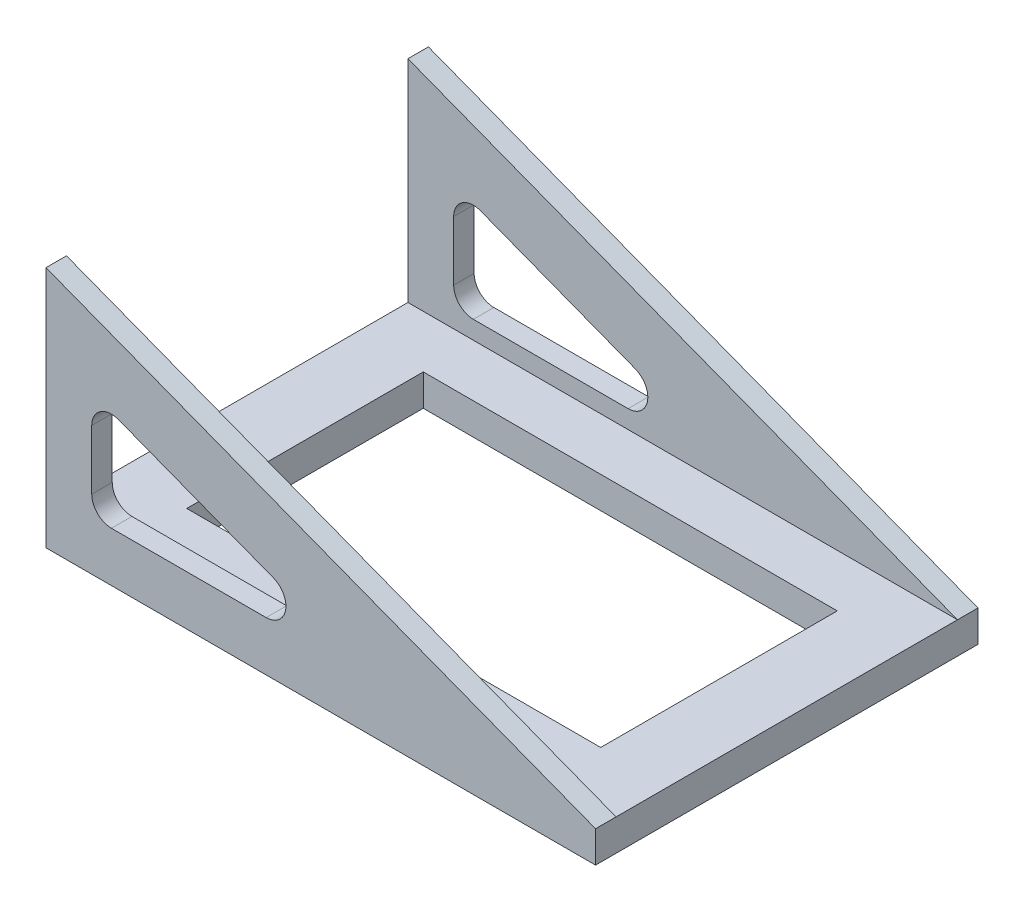
ISO-10303-21;
HEADER;
FILE_DESCRIPTION(('STEP AP214'),'2;1');
FILE_NAME('part.step','',(''),(''),'','','');
FILE_SCHEMA(('AUTOMOTIVE_DESIGN { 1 0 10303 214 1 1 1 1 }'));
ENDSEC;
DATA;
#1=APPLICATION_CONTEXT('core data for automotive mechanical design processes');
#2=APPLICATION_PROTOCOL_DEFINITION('international standard','automotive_design',2000,#1);
#3=PRODUCT_CONTEXT('',#1,'mechanical');
#4=PRODUCT('Part','Part','',(#3));
#5=PRODUCT_RELATED_PRODUCT_CATEGORY('part','',(#4));
#6=PRODUCT_DEFINITION_FORMATION('','',#4);
#7=PRODUCT_DEFINITION_CONTEXT('part definition',#1,'design');
#8=PRODUCT_DEFINITION('design','',#6,#7);
#9=PRODUCT_DEFINITION_SHAPE('','',#8);
#10=(LENGTH_UNIT() NAMED_UNIT(*) SI_UNIT(.MILLI.,.METRE.));
#11=(NAMED_UNIT(*) PLANE_ANGLE_UNIT() SI_UNIT($,.RADIAN.));
#12=(NAMED_UNIT(*) SI_UNIT($,.STERADIAN.) SOLID_ANGLE_UNIT());
#13=UNCERTAINTY_MEASURE_WITH_UNIT(LENGTH_MEASURE(1.E-05),#10,'distance_accuracy_value','');
#14=(GEOMETRIC_REPRESENTATION_CONTEXT(3) GLOBAL_UNCERTAINTY_ASSIGNED_CONTEXT((#13)) GLOBAL_UNIT_ASSIGNED_CONTEXT((#10,
#11,#12)) REPRESENTATION_CONTEXT('',''));
#15=CARTESIAN_POINT('',(0.,0.,0.));
#16=DIRECTION('',(0.,0.,1.));
#17=DIRECTION('',(1.,0.,0.));
#18=AXIS2_PLACEMENT_3D('',#15,#16,#17);
#19=CARTESIAN_POINT('',(-17.5919573041021,22.352,-54.991));
#20=DIRECTION('',(0.,0.,-1.));
#21=DIRECTION('',(-1.,0.,0.));
#22=AXIS2_PLACEMENT_3D('',#19,#20,#21);
#23=CYLINDRICAL_SURFACE('',#22,6.35000000000001);
#24=DIRECTION('',(0.,0.,1.));
#25=VECTOR('',#24,1.);
#26=CARTESIAN_POINT('',(-17.5919573041028,16.002,-54.991));
#27=LINE('',#26,#25);
#28=CARTESIAN_POINT('',(-17.5919573041025,16.002,-54.991));
#29=VERTEX_POINT('',#28);
#30=CARTESIAN_POINT('',(-17.5919573041025,16.002,-61.595));
#31=VERTEX_POINT('',#30);
#32=EDGE_CURVE('E220',#29,#31,#27,.F.);
#33=ORIENTED_EDGE('',*,*,#32,.F.);
#34=CARTESIAN_POINT('',(-17.5919573041021,22.352,-54.991));
#35=DIRECTION('',(0.,0.,-1.));
#36=DIRECTION('',(-1.,0.,0.));
#37=AXIS2_PLACEMENT_3D('',#34,#35,#36);
#38=CIRCLE('',#37,6.35000000000001);
#39=CARTESIAN_POINT('',(-15.3148623858333,28.2796756602563,-54.991));
#40=VERTEX_POINT('',#39);
#41=EDGE_CURVE('E278',#29,#40,#38,.F.);
#42=ORIENTED_EDGE('',*,*,#41,.T.);
#43=DIRECTION('',(0.,0.,1.));
#44=VECTOR('',#43,1.);
#45=CARTESIAN_POINT('',(-15.3148623858336,28.2796756602564,-54.991));
#46=LINE('',#45,#44);
#47=CARTESIAN_POINT('',(-15.3148623858333,28.2796756602563,-61.595));
#48=VERTEX_POINT('',#47);
#49=EDGE_CURVE('E231',#48,#40,#46,.T.);
#50=ORIENTED_EDGE('',*,*,#49,.F.);
#51=CARTESIAN_POINT('',(-17.5919573041021,22.352,-61.595));
#52=DIRECTION('',(0.,0.,-1.));
#53=DIRECTION('',(-1.,0.,0.));
#54=AXIS2_PLACEMENT_3D('',#51,#52,#53);
#55=CIRCLE('',#54,6.35000000000001);
#56=EDGE_CURVE('E267',#31,#48,#55,.F.);
#57=ORIENTED_EDGE('',*,*,#56,.F.);
#58=EDGE_LOOP('',(#33,#42,#50,#57));
#59=FACE_BOUND('',#58,.T.);
#60=ADVANCED_FACE('F16',(#59),#23,.F.);
#61=CARTESIAN_POINT('',(7.49719488457461,19.5165073185752,-54.991));
#62=DIRECTION('',(-0.358597624924271,-0.933492229961595,0.));
#63=DIRECTION('',(0.933492229961595,-0.358597624924271,0.));
#64=AXIS2_PLACEMENT_3D('',#61,#62,#63);
#65=PLANE('',#64);
#66=DIRECTION('',(-0.933492229961595,0.358597624924271,0.));
#67=VECTOR('',#66,1.);
#68=CARTESIAN_POINT('',(-15.3148623858336,28.2796756602564,-54.991));
#69=LINE('',#68,#67);
#70=CARTESIAN_POINT('',(-65.1599050817309,47.427466451973,-54.991));
#71=VERTEX_POINT('',#70);
#72=EDGE_CURVE('E211',#40,#71,#69,.T.);
#73=ORIENTED_EDGE('',*,*,#72,.T.);
#74=DIRECTION('',(0.,0.,-1.));
#75=VECTOR('',#74,1.);
#76=CARTESIAN_POINT('',(-65.1599050817308,47.427466451973,-54.991));
#77=LINE('',#76,#75);
#78=CARTESIAN_POINT('',(-65.1599050817309,47.427466451973,-61.595));
#79=VERTEX_POINT('',#78);
#80=EDGE_CURVE('E182',#71,#79,#77,.T.);
#81=ORIENTED_EDGE('',*,*,#80,.T.);
#82=DIRECTION('',(-0.933492229961595,0.358597624924271,0.));
#83=VECTOR('',#82,1.);
#84=CARTESIAN_POINT('',(-15.3148623858336,28.2796756602564,-61.595));
#85=LINE('',#84,#83);
#86=EDGE_CURVE('E266',#48,#79,#85,.T.);
#87=ORIENTED_EDGE('',*,*,#86,.F.);
#88=ORIENTED_EDGE('',*,*,#49,.T.);
#89=EDGE_LOOP('',(#73,#81,#87,#88));
#90=FACE_BOUND('',#89,.T.);
#91=ADVANCED_FACE('F504',(#90),#65,.T.);
#92=CARTESIAN_POINT('',(-67.437,41.4997907917169,-54.991));
#93=DIRECTION('',(0.,0.,-1.));
#94=DIRECTION('',(-1.,0.,0.));
#95=AXIS2_PLACEMENT_3D('',#92,#93,#94);
#96=CYLINDRICAL_SURFACE('',#95,6.35000000000001);
#97=ORIENTED_EDGE('',*,*,#80,.F.);
#98=CARTESIAN_POINT('',(-67.437,41.4997907917169,-54.991));
#99=DIRECTION('',(0.,0.,-1.));
#100=DIRECTION('',(-1.,0.,0.));
#101=AXIS2_PLACEMENT_3D('',#98,#99,#100);
#102=CIRCLE('',#101,6.35000000000001);
#103=CARTESIAN_POINT('',(-73.787,41.4997907917168,-54.991));
#104=VERTEX_POINT('',#103);
#105=EDGE_CURVE('E19',#71,#104,#102,.F.);
#106=ORIENTED_EDGE('',*,*,#105,.T.);
#107=DIRECTION('',(0.,0.,1.));
#108=VECTOR('',#107,1.);
#109=CARTESIAN_POINT('',(-73.787,41.4997907917168,-54.991));
#110=LINE('',#109,#108);
#111=CARTESIAN_POINT('',(-73.787,41.4997907917168,-61.595));
#112=VERTEX_POINT('',#111);
#113=EDGE_CURVE('E190',#112,#104,#110,.T.);
#114=ORIENTED_EDGE('',*,*,#113,.F.);
#115=CARTESIAN_POINT('',(-67.437,41.4997907917169,-61.595));
#116=DIRECTION('',(0.,0.,-1.));
#117=DIRECTION('',(-1.,0.,0.));
#118=AXIS2_PLACEMENT_3D('',#115,#116,#117);
#119=CIRCLE('',#118,6.35000000000001);
#120=EDGE_CURVE('E263',#79,#112,#119,.F.);
#121=ORIENTED_EDGE('',*,*,#120,.F.);
#122=EDGE_LOOP('',(#97,#106,#114,#121));
#123=FACE_BOUND('',#122,.T.);
#124=ADVANCED_FACE('F209',(#123),#96,.F.);
#125=CARTESIAN_POINT('',(-73.787,0.,-54.991));
#126=DIRECTION('',(1.,0.,0.));
#127=DIRECTION('',(0.,1.,0.));
#128=AXIS2_PLACEMENT_3D('',#125,#126,#127);
#129=PLANE('',#128);
#130=DIRECTION('',(0.,1.,0.));
#131=VECTOR('',#130,1.);
#132=CARTESIAN_POINT('',(-73.787,0.,-54.991));
#133=LINE('',#132,#131);
#134=CARTESIAN_POINT('',(-73.787,22.352,-54.991));
#135=VERTEX_POINT('',#134);
#136=EDGE_CURVE('E194',#104,#135,#133,.F.);
#137=ORIENTED_EDGE('',*,*,#136,.T.);
#138=DIRECTION('',(0.,0.,-1.));
#139=VECTOR('',#138,1.);
#140=CARTESIAN_POINT('',(-73.787,22.352,-54.991));
#141=LINE('',#140,#139);
#142=CARTESIAN_POINT('',(-73.787,22.352,-61.595));
#143=VERTEX_POINT('',#142);
#144=EDGE_CURVE('E197',#135,#143,#141,.T.);
#145=ORIENTED_EDGE('',*,*,#144,.T.);
#146=DIRECTION('',(0.,1.,0.));
#147=VECTOR('',#146,1.);
#148=CARTESIAN_POINT('',(-73.787,10.16,-61.595));
#149=LINE('',#148,#147);
#150=EDGE_CURVE('E195',#112,#143,#149,.F.);
#151=ORIENTED_EDGE('',*,*,#150,.F.);
#152=ORIENTED_EDGE('',*,*,#113,.T.);
#153=EDGE_LOOP('',(#137,#145,#151,#152));
#154=FACE_BOUND('',#153,.T.);
#155=ADVANCED_FACE('F192',(#154),#129,.T.);
#156=CARTESIAN_POINT('',(-67.437,22.352,-54.991));
#157=DIRECTION('',(0.,0.,-1.));
#158=DIRECTION('',(-1.,0.,0.));
#159=AXIS2_PLACEMENT_3D('',#156,#157,#158);
#160=CYLINDRICAL_SURFACE('',#159,6.34999999999999);
#161=ORIENTED_EDGE('',*,*,#144,.F.);
#162=CARTESIAN_POINT('',(-67.437,22.352,-54.991));
#163=DIRECTION('',(0.,0.,-1.));
#164=DIRECTION('',(-1.,0.,0.));
#165=AXIS2_PLACEMENT_3D('',#162,#163,#164);
#166=CIRCLE('',#165,6.34999999999999);
#167=CARTESIAN_POINT('',(-67.437,16.002,-54.991));
#168=VERTEX_POINT('',#167);
#169=EDGE_CURVE('E206',#135,#168,#166,.F.);
#170=ORIENTED_EDGE('',*,*,#169,.T.);
#171=DIRECTION('',(0.,0.,1.));
#172=VECTOR('',#171,1.);
#173=CARTESIAN_POINT('',(-67.437,16.002,-54.991));
#174=LINE('',#173,#172);
#175=CARTESIAN_POINT('',(-67.437,16.002,-61.595));
#176=VERTEX_POINT('',#175);
#177=EDGE_CURVE('E224',#176,#168,#174,.T.);
#178=ORIENTED_EDGE('',*,*,#177,.F.);
#179=CARTESIAN_POINT('',(-67.437,22.352,-61.595));
#180=DIRECTION('',(0.,0.,-1.));
#181=DIRECTION('',(-1.,0.,0.));
#182=AXIS2_PLACEMENT_3D('',#179,#180,#181);
#183=CIRCLE('',#182,6.34999999999999);
#184=EDGE_CURVE('E259',#143,#176,#183,.F.);
#185=ORIENTED_EDGE('',*,*,#184,.F.);
#186=EDGE_LOOP('',(#161,#170,#178,#185));
#187=FACE_BOUND('',#186,.T.);
#188=ADVANCED_FACE('F498',(#187),#160,.F.);
#189=CARTESIAN_POINT('',(0.,16.002,-54.991));
#190=DIRECTION('',(0.,1.,0.));
#191=DIRECTION('',(-1.,0.,0.));
#192=AXIS2_PLACEMENT_3D('',#189,#190,#191);
#193=PLANE('',#192);
#194=DIRECTION('',(-1.,0.,0.));
#195=VECTOR('',#194,1.);
#196=CARTESIAN_POINT('',(0.,16.002,-54.991));
#197=LINE('',#196,#195);
#198=EDGE_CURVE('E282',#168,#29,#197,.F.);
#199=ORIENTED_EDGE('',*,*,#198,.T.);
#200=ORIENTED_EDGE('',*,*,#32,.T.);
#201=DIRECTION('',(-1.,0.,0.));
#202=VECTOR('',#201,1.);
#203=CARTESIAN_POINT('',(0.,16.002,-61.595));
#204=LINE('',#203,#202);
#205=EDGE_CURVE('E262',#176,#31,#204,.F.);
#206=ORIENTED_EDGE('',*,*,#205,.F.);
#207=ORIENTED_EDGE('',*,*,#177,.T.);
#208=EDGE_LOOP('',(#199,#200,#206,#207));
#209=FACE_BOUND('',#208,.T.);
#210=ADVANCED_FACE('F494',(#209),#193,.T.);
#211=CARTESIAN_POINT('',(0.,0.,54.991));
#212=DIRECTION('',(0.,0.,1.));
#213=DIRECTION('',(1.,0.,0.));
#214=AXIS2_PLACEMENT_3D('',#211,#212,#213);
#215=PLANE('',#214);
#216=DIRECTION('',(1.,0.,0.));
#217=VECTOR('',#216,1.);
#218=CARTESIAN_POINT('',(0.,10.16,54.991));
#219=LINE('',#218,#217);
#220=CARTESIAN_POINT('',(-88.519,10.16,54.991));
#221=VERTEX_POINT('',#220);
#222=CARTESIAN_POINT('',(88.519,10.16,54.991));
#223=VERTEX_POINT('',#222);
#224=EDGE_CURVE('E215',#221,#223,#219,.T.);
#225=ORIENTED_EDGE('',*,*,#224,.F.);
#226=DIRECTION('',(0.,1.,0.));
#227=VECTOR('',#226,1.);
#228=CARTESIAN_POINT('',(-88.519,10.16,54.991));
#229=LINE('',#228,#227);
#230=CARTESIAN_POINT('',(-88.519,78.1685,54.991));
#231=VERTEX_POINT('',#230);
#232=EDGE_CURVE('E355',#231,#221,#229,.F.);
#233=ORIENTED_EDGE('',*,*,#232,.F.);
#234=DIRECTION('',(0.933492229961595,-0.358597624924271,0.));
#235=VECTOR('',#234,1.);
#236=CARTESIAN_POINT('',(14.7838986230358,38.4850694313948,54.991));
#237=LINE('',#236,#235);
#238=EDGE_CURVE('E296',#231,#223,#237,.T.);
#239=ORIENTED_EDGE('',*,*,#238,.T.);
#240=EDGE_LOOP('',(#225,#233,#239));
#241=FACE_BOUND('',#240,.T.);
#242=CARTESIAN_POINT('',(-17.5919573041021,22.352,54.991));
#243=DIRECTION('',(0.,0.,1.));
#244=DIRECTION('',(1.,0.,0.));
#245=AXIS2_PLACEMENT_3D('',#242,#243,#244);
#246=CIRCLE('',#245,6.35000000000001);
#247=CARTESIAN_POINT('',(-17.5919573041025,16.002,54.991));
#248=VERTEX_POINT('',#247);
#249=CARTESIAN_POINT('',(-15.3148623858333,28.2796756602563,54.991));
#250=VERTEX_POINT('',#249);
#251=EDGE_CURVE('E271',#248,#250,#246,.T.);
#252=ORIENTED_EDGE('',*,*,#251,.T.);
#253=DIRECTION('',(-0.933492229961595,0.358597624924271,0.));
#254=VECTOR('',#253,1.);
#255=CARTESIAN_POINT('',(7.49719488457461,19.5165073185752,54.991));
#256=LINE('',#255,#254);
#257=CARTESIAN_POINT('',(-65.1599050817309,47.427466451973,54.991));
#258=VERTEX_POINT('',#257);
#259=EDGE_CURVE('E242',#250,#258,#256,.T.);
#260=ORIENTED_EDGE('',*,*,#259,.T.);
#261=CARTESIAN_POINT('',(-67.437,41.4997907917169,54.991));
#262=DIRECTION('',(0.,0.,1.));
#263=DIRECTION('',(1.,0.,0.));
#264=AXIS2_PLACEMENT_3D('',#261,#262,#263);
#265=CIRCLE('',#264,6.35000000000001);
#266=CARTESIAN_POINT('',(-73.787,41.4997907917168,54.991));
#267=VERTEX_POINT('',#266);
#268=EDGE_CURVE('E276',#258,#267,#265,.T.);
#269=ORIENTED_EDGE('',*,*,#268,.T.);
#270=DIRECTION('',(0.,-1.,0.));
#271=VECTOR('',#270,1.);
#272=CARTESIAN_POINT('',(-73.787,0.,54.991));
#273=LINE('',#272,#271);
#274=CARTESIAN_POINT('',(-73.787,22.352,54.991));
#275=VERTEX_POINT('',#274);
#276=EDGE_CURVE('E238',#267,#275,#273,.T.);
#277=ORIENTED_EDGE('',*,*,#276,.T.);
#278=CARTESIAN_POINT('',(-67.437,22.352,54.991));
#279=DIRECTION('',(0.,0.,1.));
#280=DIRECTION('',(1.,0.,0.));
#281=AXIS2_PLACEMENT_3D('',#278,#279,#280);
#282=CIRCLE('',#281,6.34999999999999);
#283=CARTESIAN_POINT('',(-67.437,16.002,54.991));
#284=VERTEX_POINT('',#283);
#285=EDGE_CURVE('E274',#275,#284,#282,.T.);
#286=ORIENTED_EDGE('',*,*,#285,.T.);
#287=DIRECTION('',(1.,0.,0.));
#288=VECTOR('',#287,1.);
#289=CARTESIAN_POINT('',(0.,16.002,54.991));
#290=LINE('',#289,#288);
#291=EDGE_CURVE('E234',#284,#248,#290,.T.);
#292=ORIENTED_EDGE('',*,*,#291,.T.);
#293=EDGE_LOOP('',(#252,#260,#269,#277,#286,#292));
#294=FACE_BOUND('',#293,.T.);
#295=ADVANCED_FACE('F490',(#241,#294),#215,.F.);
#296=CARTESIAN_POINT('',(0.,10.16,0.));
#297=DIRECTION('',(0.,1.,0.));
#298=DIRECTION('',(0.,0.,1.));
#299=AXIS2_PLACEMENT_3D('',#296,#297,#298);
#300=PLANE('',#299);
#301=DIRECTION('',(0.,0.,1.));
#302=VECTOR('',#301,1.);
#303=CARTESIAN_POINT('',(-88.519,10.16,0.));
#304=LINE('',#303,#302);
#305=CARTESIAN_POINT('',(-88.519,10.16,-54.991));
#306=VERTEX_POINT('',#305);
#307=EDGE_CURVE('E358',#221,#306,#304,.F.);
#308=ORIENTED_EDGE('',*,*,#307,.F.);
#309=ORIENTED_EDGE('',*,*,#224,.T.);
#310=DIRECTION('',(0.,0.,1.));
#311=VECTOR('',#310,1.);
#312=CARTESIAN_POINT('',(88.519,10.16,0.));
#313=LINE('',#312,#311);
#314=CARTESIAN_POINT('',(88.519,10.16,-54.991));
#315=VERTEX_POINT('',#314);
#316=EDGE_CURVE('E335',#223,#315,#313,.F.);
#317=ORIENTED_EDGE('',*,*,#316,.T.);
#318=DIRECTION('',(-1.,0.,0.));
#319=VECTOR('',#318,1.);
#320=CARTESIAN_POINT('',(0.,10.16,-54.991));
#321=LINE('',#320,#319);
#322=EDGE_CURVE('E281',#315,#306,#321,.T.);
#323=ORIENTED_EDGE('',*,*,#322,.T.);
#324=EDGE_LOOP('',(#308,#309,#317,#323));
#325=FACE_BOUND('',#324,.T.);
#326=DIRECTION('',(0.,0.,1.));
#327=VECTOR('',#326,1.);
#328=CARTESIAN_POINT('',(-66.675,10.16,0.));
#329=LINE('',#328,#327);
#330=CARTESIAN_POINT('',(-66.675,10.16,38.1));
#331=VERTEX_POINT('',#330);
#332=CARTESIAN_POINT('',(-66.675,10.16,-38.1));
#333=VERTEX_POINT('',#332);
#334=EDGE_CURVE('E317',#331,#333,#329,.F.);
#335=ORIENTED_EDGE('',*,*,#334,.T.);
#336=DIRECTION('',(-1.,0.,0.));
#337=VECTOR('',#336,1.);
#338=CARTESIAN_POINT('',(0.,10.16,-38.1));
#339=LINE('',#338,#337);
#340=CARTESIAN_POINT('',(66.675,10.16,-38.1));
#341=VERTEX_POINT('',#340);
#342=EDGE_CURVE('E322',#333,#341,#339,.F.);
#343=ORIENTED_EDGE('',*,*,#342,.T.);
#344=DIRECTION('',(0.,0.,1.));
#345=VECTOR('',#344,1.);
#346=CARTESIAN_POINT('',(66.675,10.16,0.));
#347=LINE('',#346,#345);
#348=CARTESIAN_POINT('',(66.675,10.16,38.1));
#349=VERTEX_POINT('',#348);
#350=EDGE_CURVE('E328',#349,#341,#347,.F.);
#351=ORIENTED_EDGE('',*,*,#350,.F.);
#352=DIRECTION('',(-1.,0.,0.));
#353=VECTOR('',#352,1.);
#354=CARTESIAN_POINT('',(0.,10.16,38.1));
#355=LINE('',#354,#353);
#356=EDGE_CURVE('E273',#331,#349,#355,.F.);
#357=ORIENTED_EDGE('',*,*,#356,.F.);
#358=EDGE_LOOP('',(#335,#343,#351,#357));
#359=FACE_BOUND('',#358,.T.);
#360=ADVANCED_FACE('F486',(#325,#359),#300,.T.);
#361=CARTESIAN_POINT('',(0.,0.,-54.991));
#362=DIRECTION('',(0.,0.,-1.));
#363=DIRECTION('',(-1.,0.,0.));
#364=AXIS2_PLACEMENT_3D('',#361,#362,#363);
#365=PLANE('',#364);
#366=DIRECTION('',(0.,1.,0.));
#367=VECTOR('',#366,1.);
#368=CARTESIAN_POINT('',(-88.519,10.16,-54.991));
#369=LINE('',#368,#367);
#370=CARTESIAN_POINT('',(-88.519,78.1685,-54.991));
#371=VERTEX_POINT('',#370);
#372=EDGE_CURVE('E360',#306,#371,#369,.T.);
#373=ORIENTED_EDGE('',*,*,#372,.F.);
#374=ORIENTED_EDGE('',*,*,#322,.F.);
#375=DIRECTION('',(-0.933492229961595,0.358597624924271,0.));
#376=VECTOR('',#375,1.);
#377=CARTESIAN_POINT('',(14.7838986230358,38.4850694313948,-54.991));
#378=LINE('',#377,#376);
#379=EDGE_CURVE('E292',#371,#315,#378,.F.);
#380=ORIENTED_EDGE('',*,*,#379,.F.);
#381=EDGE_LOOP('',(#373,#374,#380));
#382=FACE_BOUND('',#381,.T.);
#383=ORIENTED_EDGE('',*,*,#198,.F.);
#384=ORIENTED_EDGE('',*,*,#169,.F.);
#385=ORIENTED_EDGE('',*,*,#136,.F.);
#386=ORIENTED_EDGE('',*,*,#105,.F.);
#387=ORIENTED_EDGE('',*,*,#72,.F.);
#388=ORIENTED_EDGE('',*,*,#41,.F.);
#389=EDGE_LOOP('',(#383,#384,#385,#386,#387,#388));
#390=FACE_BOUND('',#389,.T.);
#391=ADVANCED_FACE('F202',(#382,#390),#365,.F.);
#392=CARTESIAN_POINT('',(14.7838986230358,38.4850694313948,-54.991));
#393=DIRECTION('',(0.358597624924271,0.933492229961595,0.));
#394=DIRECTION('',(-0.933492229961595,0.358597624924271,0.));
#395=AXIS2_PLACEMENT_3D('',#392,#393,#394);
#396=PLANE('',#395);
#397=ORIENTED_EDGE('',*,*,#379,.T.);
#398=DIRECTION('',(0.,0.,1.));
#399=VECTOR('',#398,1.);
#400=CARTESIAN_POINT('',(88.519,10.16,0.));
#401=LINE('',#400,#399);
#402=CARTESIAN_POINT('',(88.519,10.16,-61.595));
#403=VERTEX_POINT('',#402);
#404=EDGE_CURVE('E338',#315,#403,#401,.F.);
#405=ORIENTED_EDGE('',*,*,#404,.T.);
#406=DIRECTION('',(0.933492229961595,-0.358597624924271,0.));
#407=VECTOR('',#406,1.);
#408=CARTESIAN_POINT('',(-88.519,78.1685,-61.595));
#409=LINE('',#408,#407);
#410=CARTESIAN_POINT('',(-88.519,78.1685,-61.595));
#411=VERTEX_POINT('',#410);
#412=EDGE_CURVE('E341',#411,#403,#409,.T.);
#413=ORIENTED_EDGE('',*,*,#412,.F.);
#414=DIRECTION('',(0.,0.,1.));
#415=VECTOR('',#414,1.);
#416=CARTESIAN_POINT('',(-88.519,78.1685,0.));
#417=LINE('',#416,#415);
#418=EDGE_CURVE('E363',#371,#411,#417,.F.);
#419=ORIENTED_EDGE('',*,*,#418,.F.);
#420=EDGE_LOOP('',(#397,#405,#413,#419));
#421=FACE_BOUND('',#420,.T.);
#422=ADVANCED_FACE('F479',(#421),#396,.T.);
#423=CARTESIAN_POINT('',(14.7838986230358,38.4850694313948,54.991));
#424=DIRECTION('',(-0.358597624924271,-0.933492229961595,0.));
#425=DIRECTION('',(0.933492229961595,-0.358597624924271,0.));
#426=AXIS2_PLACEMENT_3D('',#423,#424,#425);
#427=PLANE('',#426);
#428=DIRECTION('',(0.,0.,1.));
#429=VECTOR('',#428,1.);
#430=CARTESIAN_POINT('',(88.519,10.16,0.));
#431=LINE('',#430,#429);
#432=CARTESIAN_POINT('',(88.519,10.16,61.595));
#433=VERTEX_POINT('',#432);
#434=EDGE_CURVE('E332',#433,#223,#431,.F.);
#435=ORIENTED_EDGE('',*,*,#434,.T.);
#436=ORIENTED_EDGE('',*,*,#238,.F.);
#437=DIRECTION('',(0.,0.,1.));
#438=VECTOR('',#437,1.);
#439=CARTESIAN_POINT('',(-88.519,78.1685,0.));
#440=LINE('',#439,#438);
#441=CARTESIAN_POINT('',(-88.519,78.1685,61.595));
#442=VERTEX_POINT('',#441);
#443=EDGE_CURVE('E351',#442,#231,#440,.F.);
#444=ORIENTED_EDGE('',*,*,#443,.F.);
#445=DIRECTION('',(0.933492229961595,-0.358597624924271,0.));
#446=VECTOR('',#445,1.);
#447=CARTESIAN_POINT('',(-88.519,78.1685,61.595));
#448=LINE('',#447,#446);
#449=EDGE_CURVE('E370',#442,#433,#448,.T.);
#450=ORIENTED_EDGE('',*,*,#449,.T.);
#451=EDGE_LOOP('',(#435,#436,#444,#450));
#452=FACE_BOUND('',#451,.T.);
#453=ADVANCED_FACE('F475',(#452),#427,.F.);
#454=CARTESIAN_POINT('',(7.49719488457461,19.5165073185752,54.991));
#455=DIRECTION('',(0.358597624924271,0.933492229961595,0.));
#456=DIRECTION('',(-0.933492229961595,0.358597624924271,0.));
#457=AXIS2_PLACEMENT_3D('',#454,#455,#456);
#458=PLANE('',#457);
#459=DIRECTION('',(0.,0.,1.));
#460=VECTOR('',#459,1.);
#461=CARTESIAN_POINT('',(-65.1599050817308,47.427466451973,54.991));
#462=LINE('',#461,#460);
#463=CARTESIAN_POINT('',(-65.1599050817309,47.427466451973,61.595));
#464=VERTEX_POINT('',#463);
#465=EDGE_CURVE('E244',#464,#258,#462,.F.);
#466=ORIENTED_EDGE('',*,*,#465,.T.);
#467=ORIENTED_EDGE('',*,*,#259,.F.);
#468=DIRECTION('',(0.,0.,1.));
#469=VECTOR('',#468,1.);
#470=CARTESIAN_POINT('',(-15.3148623858336,28.2796756602564,54.991));
#471=LINE('',#470,#469);
#472=CARTESIAN_POINT('',(-15.3148623858333,28.2796756602563,61.595));
#473=VERTEX_POINT('',#472);
#474=EDGE_CURVE('E245',#473,#250,#471,.F.);
#475=ORIENTED_EDGE('',*,*,#474,.F.);
#476=DIRECTION('',(-0.933492229961595,0.358597624924271,0.));
#477=VECTOR('',#476,1.);
#478=CARTESIAN_POINT('',(-15.3148623858336,28.2796756602564,61.595));
#479=LINE('',#478,#477);
#480=EDGE_CURVE('E258',#473,#464,#479,.T.);
#481=ORIENTED_EDGE('',*,*,#480,.T.);
#482=EDGE_LOOP('',(#466,#467,#475,#481));
#483=FACE_BOUND('',#482,.T.);
#484=ADVANCED_FACE('F471',(#483),#458,.F.);
#485=CARTESIAN_POINT('',(-67.437,41.4997907917169,54.991));
#486=DIRECTION('',(0.,0.,1.));
#487=DIRECTION('',(1.,0.,0.));
#488=AXIS2_PLACEMENT_3D('',#485,#486,#487);
#489=CYLINDRICAL_SURFACE('',#488,6.35000000000001);
#490=DIRECTION('',(0.,0.,1.));
#491=VECTOR('',#490,1.);
#492=CARTESIAN_POINT('',(-73.787,41.4997907917168,54.991));
#493=LINE('',#492,#491);
#494=CARTESIAN_POINT('',(-73.787,41.4997907917168,61.595));
#495=VERTEX_POINT('',#494);
#496=EDGE_CURVE('E241',#495,#267,#493,.F.);
#497=ORIENTED_EDGE('',*,*,#496,.T.);
#498=ORIENTED_EDGE('',*,*,#268,.F.);
#499=ORIENTED_EDGE('',*,*,#465,.F.);
#500=CARTESIAN_POINT('',(-67.437,41.4997907917169,61.595));
#501=DIRECTION('',(0.,0.,1.));
#502=DIRECTION('',(1.,0.,0.));
#503=AXIS2_PLACEMENT_3D('',#500,#501,#502);
#504=CIRCLE('',#503,6.35000000000001);
#505=EDGE_CURVE('E254',#464,#495,#504,.T.);
#506=ORIENTED_EDGE('',*,*,#505,.T.);
#507=EDGE_LOOP('',(#497,#498,#499,#506));
#508=FACE_BOUND('',#507,.T.);
#509=ADVANCED_FACE('F467',(#508),#489,.F.);
#510=CARTESIAN_POINT('',(-73.787,0.,54.991));
#511=DIRECTION('',(-1.,0.,0.));
#512=DIRECTION('',(0.,-1.,0.));
#513=AXIS2_PLACEMENT_3D('',#510,#511,#512);
#514=PLANE('',#513);
#515=DIRECTION('',(0.,0.,1.));
#516=VECTOR('',#515,1.);
#517=CARTESIAN_POINT('',(-73.787,22.352,54.991));
#518=LINE('',#517,#516);
#519=CARTESIAN_POINT('',(-73.787,22.352,61.595));
#520=VERTEX_POINT('',#519);
#521=EDGE_CURVE('E240',#520,#275,#518,.F.);
#522=ORIENTED_EDGE('',*,*,#521,.T.);
#523=ORIENTED_EDGE('',*,*,#276,.F.);
#524=ORIENTED_EDGE('',*,*,#496,.F.);
#525=DIRECTION('',(0.,1.,0.));
#526=VECTOR('',#525,1.);
#527=CARTESIAN_POINT('',(-73.787,10.16,61.595));
#528=LINE('',#527,#526);
#529=EDGE_CURVE('E253',#495,#520,#528,.F.);
#530=ORIENTED_EDGE('',*,*,#529,.T.);
#531=EDGE_LOOP('',(#522,#523,#524,#530));
#532=FACE_BOUND('',#531,.T.);
#533=ADVANCED_FACE('F463',(#532),#514,.F.);
#534=CARTESIAN_POINT('',(-67.437,22.352,54.991));
#535=DIRECTION('',(0.,0.,1.));
#536=DIRECTION('',(1.,0.,0.));
#537=AXIS2_PLACEMENT_3D('',#534,#535,#536);
#538=CYLINDRICAL_SURFACE('',#537,6.34999999999999);
#539=DIRECTION('',(0.,0.,1.));
#540=VECTOR('',#539,1.);
#541=CARTESIAN_POINT('',(-67.437,16.002,54.991));
#542=LINE('',#541,#540);
#543=CARTESIAN_POINT('',(-67.437,16.002,61.595));
#544=VERTEX_POINT('',#543);
#545=EDGE_CURVE('E237',#544,#284,#542,.F.);
#546=ORIENTED_EDGE('',*,*,#545,.T.);
#547=ORIENTED_EDGE('',*,*,#285,.F.);
#548=ORIENTED_EDGE('',*,*,#521,.F.);
#549=CARTESIAN_POINT('',(-67.437,22.352,61.595));
#550=DIRECTION('',(0.,0.,1.));
#551=DIRECTION('',(1.,0.,0.));
#552=AXIS2_PLACEMENT_3D('',#549,#550,#551);
#553=CIRCLE('',#552,6.34999999999999);
#554=EDGE_CURVE('E250',#520,#544,#553,.T.);
#555=ORIENTED_EDGE('',*,*,#554,.T.);
#556=EDGE_LOOP('',(#546,#547,#548,#555));
#557=FACE_BOUND('',#556,.T.);
#558=ADVANCED_FACE('F459',(#557),#538,.F.);
#559=CARTESIAN_POINT('',(0.,16.002,54.991));
#560=DIRECTION('',(0.,-1.,0.));
#561=DIRECTION('',(1.,0.,0.));
#562=AXIS2_PLACEMENT_3D('',#559,#560,#561);
#563=PLANE('',#562);
#564=DIRECTION('',(0.,0.,1.));
#565=VECTOR('',#564,1.);
#566=CARTESIAN_POINT('',(-17.5919573041028,16.002,54.991));
#567=LINE('',#566,#565);
#568=CARTESIAN_POINT('',(-17.5919573041025,16.002,61.595));
#569=VERTEX_POINT('',#568);
#570=EDGE_CURVE('E236',#569,#248,#567,.F.);
#571=ORIENTED_EDGE('',*,*,#570,.T.);
#572=ORIENTED_EDGE('',*,*,#291,.F.);
#573=ORIENTED_EDGE('',*,*,#545,.F.);
#574=DIRECTION('',(-1.,0.,0.));
#575=VECTOR('',#574,1.);
#576=CARTESIAN_POINT('',(0.,16.002,61.595));
#577=LINE('',#576,#575);
#578=EDGE_CURVE('E249',#544,#569,#577,.F.);
#579=ORIENTED_EDGE('',*,*,#578,.T.);
#580=EDGE_LOOP('',(#571,#572,#573,#579));
#581=FACE_BOUND('',#580,.T.);
#582=ADVANCED_FACE('F455',(#581),#563,.F.);
#583=CARTESIAN_POINT('',(-17.5919573041021,22.352,54.991));
#584=DIRECTION('',(0.,0.,1.));
#585=DIRECTION('',(1.,0.,0.));
#586=AXIS2_PLACEMENT_3D('',#583,#584,#585);
#587=CYLINDRICAL_SURFACE('',#586,6.35000000000001);
#588=ORIENTED_EDGE('',*,*,#251,.F.);
#589=ORIENTED_EDGE('',*,*,#570,.F.);
#590=CARTESIAN_POINT('',(-17.5919573041021,22.352,61.595));
#591=DIRECTION('',(0.,0.,1.));
#592=DIRECTION('',(1.,0.,0.));
#593=AXIS2_PLACEMENT_3D('',#590,#591,#592);
#594=CIRCLE('',#593,6.35000000000001);
#595=EDGE_CURVE('E246',#569,#473,#594,.T.);
#596=ORIENTED_EDGE('',*,*,#595,.T.);
#597=ORIENTED_EDGE('',*,*,#474,.T.);
#598=EDGE_LOOP('',(#588,#589,#596,#597));
#599=FACE_BOUND('',#598,.T.);
#600=ADVANCED_FACE('F451',(#599),#587,.F.);
#601=CARTESIAN_POINT('',(0.,10.16,38.1));
#602=DIRECTION('',(0.,0.,-1.));
#603=DIRECTION('',(-1.,0.,0.));
#604=AXIS2_PLACEMENT_3D('',#601,#602,#603);
#605=PLANE('',#604);
#606=ORIENTED_EDGE('',*,*,#356,.T.);
#607=DIRECTION('',(0.,1.,0.));
#608=VECTOR('',#607,1.);
#609=CARTESIAN_POINT('',(66.675,10.16,38.1));
#610=LINE('',#609,#608);
#611=CARTESIAN_POINT('',(66.675,0.,38.1));
#612=VERTEX_POINT('',#611);
#613=EDGE_CURVE('E325',#612,#349,#610,.T.);
#614=ORIENTED_EDGE('',*,*,#613,.F.);
#615=DIRECTION('',(1.,0.,0.));
#616=VECTOR('',#615,1.);
#617=CARTESIAN_POINT('',(0.,0.,38.1));
#618=LINE('',#617,#616);
#619=CARTESIAN_POINT('',(-66.675,0.,38.1));
#620=VERTEX_POINT('',#619);
#621=EDGE_CURVE('E248',#612,#620,#618,.F.);
#622=ORIENTED_EDGE('',*,*,#621,.T.);
#623=DIRECTION('',(0.,1.,0.));
#624=VECTOR('',#623,1.);
#625=CARTESIAN_POINT('',(-66.675,10.16,38.1));
#626=LINE('',#625,#624);
#627=EDGE_CURVE('E314',#620,#331,#626,.T.);
#628=ORIENTED_EDGE('',*,*,#627,.T.);
#629=EDGE_LOOP('',(#606,#614,#622,#628));
#630=FACE_BOUND('',#629,.T.);
#631=ADVANCED_FACE('F447',(#630),#605,.T.);
#632=CARTESIAN_POINT('',(-66.675,10.16,0.));
#633=DIRECTION('',(-1.,0.,0.));
#634=DIRECTION('',(0.,0.,1.));
#635=AXIS2_PLACEMENT_3D('',#632,#633,#634);
#636=PLANE('',#635);
#637=DIRECTION('',(0.,1.,0.));
#638=VECTOR('',#637,1.);
#639=CARTESIAN_POINT('',(-66.675,10.16,-38.1));
#640=LINE('',#639,#638);
#641=CARTESIAN_POINT('',(-66.675,0.,-38.1));
#642=VERTEX_POINT('',#641);
#643=EDGE_CURVE('E319',#642,#333,#640,.T.);
#644=ORIENTED_EDGE('',*,*,#643,.T.);
#645=ORIENTED_EDGE('',*,*,#334,.F.);
#646=ORIENTED_EDGE('',*,*,#627,.F.);
#647=DIRECTION('',(0.,0.,1.));
#648=VECTOR('',#647,1.);
#649=CARTESIAN_POINT('',(-66.675,0.,0.));
#650=LINE('',#649,#648);
#651=EDGE_CURVE('E386',#620,#642,#650,.F.);
#652=ORIENTED_EDGE('',*,*,#651,.T.);
#653=EDGE_LOOP('',(#644,#645,#646,#652));
#654=FACE_BOUND('',#653,.T.);
#655=ADVANCED_FACE('F443',(#654),#636,.F.);
#656=CARTESIAN_POINT('',(0.,10.16,-38.1));
#657=DIRECTION('',(0.,0.,-1.));
#658=DIRECTION('',(-1.,0.,0.));
#659=AXIS2_PLACEMENT_3D('',#656,#657,#658);
#660=PLANE('',#659);
#661=DIRECTION('',(0.,1.,0.));
#662=VECTOR('',#661,1.);
#663=CARTESIAN_POINT('',(66.675,10.16,-38.1));
#664=LINE('',#663,#662);
#665=CARTESIAN_POINT('',(66.675,0.,-38.1));
#666=VERTEX_POINT('',#665);
#667=EDGE_CURVE('E330',#341,#666,#664,.F.);
#668=ORIENTED_EDGE('',*,*,#667,.F.);
#669=ORIENTED_EDGE('',*,*,#342,.F.);
#670=ORIENTED_EDGE('',*,*,#643,.F.);
#671=DIRECTION('',(1.,0.,0.));
#672=VECTOR('',#671,1.);
#673=CARTESIAN_POINT('',(0.,0.,-38.1));
#674=LINE('',#673,#672);
#675=EDGE_CURVE('E389',#642,#666,#674,.T.);
#676=ORIENTED_EDGE('',*,*,#675,.T.);
#677=EDGE_LOOP('',(#668,#669,#670,#676));
#678=FACE_BOUND('',#677,.T.);
#679=ADVANCED_FACE('F439',(#678),#660,.F.);
#680=CARTESIAN_POINT('',(66.675,10.16,0.));
#681=DIRECTION('',(-1.,0.,0.));
#682=DIRECTION('',(0.,0.,1.));
#683=AXIS2_PLACEMENT_3D('',#680,#681,#682);
#684=PLANE('',#683);
#685=ORIENTED_EDGE('',*,*,#350,.T.);
#686=ORIENTED_EDGE('',*,*,#667,.T.);
#687=DIRECTION('',(0.,0.,1.));
#688=VECTOR('',#687,1.);
#689=CARTESIAN_POINT('',(66.675,0.,0.));
#690=LINE('',#689,#688);
#691=EDGE_CURVE('E392',#666,#612,#690,.T.);
#692=ORIENTED_EDGE('',*,*,#691,.T.);
#693=ORIENTED_EDGE('',*,*,#613,.T.);
#694=EDGE_LOOP('',(#685,#686,#692,#693));
#695=FACE_BOUND('',#694,.T.);
#696=ADVANCED_FACE('F436',(#695),#684,.T.);
#697=CARTESIAN_POINT('',(88.519,10.16,0.));
#698=DIRECTION('',(-1.,0.,0.));
#699=DIRECTION('',(0.,0.,1.));
#700=AXIS2_PLACEMENT_3D('',#697,#698,#699);
#701=PLANE('',#700);
#702=DIRECTION('',(0.,1.,0.));
#703=VECTOR('',#702,1.);
#704=CARTESIAN_POINT('',(88.519,10.16,-61.595));
#705=LINE('',#704,#703);
#706=CARTESIAN_POINT('',(88.519,0.,-61.595));
#707=VERTEX_POINT('',#706);
#708=EDGE_CURVE('E270',#403,#707,#705,.F.);
#709=ORIENTED_EDGE('',*,*,#708,.F.);
#710=ORIENTED_EDGE('',*,*,#404,.F.);
#711=ORIENTED_EDGE('',*,*,#316,.F.);
#712=ORIENTED_EDGE('',*,*,#434,.F.);
#713=DIRECTION('',(0.,1.,0.));
#714=VECTOR('',#713,1.);
#715=CARTESIAN_POINT('',(88.519,10.16,61.595));
#716=LINE('',#715,#714);
#717=CARTESIAN_POINT('',(88.519,0.,61.595));
#718=VERTEX_POINT('',#717);
#719=EDGE_CURVE('E374',#433,#718,#716,.F.);
#720=ORIENTED_EDGE('',*,*,#719,.T.);
#721=DIRECTION('',(0.,0.,1.));
#722=VECTOR('',#721,1.);
#723=CARTESIAN_POINT('',(88.519,0.,0.));
#724=LINE('',#723,#722);
#725=EDGE_CURVE('E395',#718,#707,#724,.F.);
#726=ORIENTED_EDGE('',*,*,#725,.T.);
#727=EDGE_LOOP('',(#709,#710,#711,#712,#720,#726));
#728=FACE_BOUND('',#727,.T.);
#729=ADVANCED_FACE('F416',(#728),#701,.F.);
#730=CARTESIAN_POINT('',(0.,10.16,-61.595));
#731=DIRECTION('',(0.,0.,-1.));
#732=DIRECTION('',(-1.,0.,0.));
#733=AXIS2_PLACEMENT_3D('',#730,#731,#732);
#734=PLANE('',#733);
#735=ORIENTED_EDGE('',*,*,#184,.T.);
#736=ORIENTED_EDGE('',*,*,#205,.T.);
#737=ORIENTED_EDGE('',*,*,#56,.T.);
#738=ORIENTED_EDGE('',*,*,#86,.T.);
#739=ORIENTED_EDGE('',*,*,#120,.T.);
#740=ORIENTED_EDGE('',*,*,#150,.T.);
#741=EDGE_LOOP('',(#735,#736,#737,#738,#739,#740));
#742=FACE_BOUND('',#741,.T.);
#743=ORIENTED_EDGE('',*,*,#412,.T.);
#744=ORIENTED_EDGE('',*,*,#708,.T.);
#745=DIRECTION('',(1.,0.,0.));
#746=VECTOR('',#745,1.);
#747=CARTESIAN_POINT('',(0.,0.,-61.595));
#748=LINE('',#747,#746);
#749=CARTESIAN_POINT('',(-88.519,0.,-61.595));
#750=VERTEX_POINT('',#749);
#751=EDGE_CURVE('E398',#707,#750,#748,.F.);
#752=ORIENTED_EDGE('',*,*,#751,.T.);
#753=DIRECTION('',(0.,1.,0.));
#754=VECTOR('',#753,1.);
#755=CARTESIAN_POINT('',(-88.519,10.16,-61.595));
#756=LINE('',#755,#754);
#757=EDGE_CURVE('E365',#411,#750,#756,.F.);
#758=ORIENTED_EDGE('',*,*,#757,.F.);
#759=EDGE_LOOP('',(#743,#744,#752,#758));
#760=FACE_BOUND('',#759,.T.);
#761=ADVANCED_FACE('F411',(#742,#760),#734,.T.);
#762=CARTESIAN_POINT('',(-88.519,10.16,0.));
#763=DIRECTION('',(-1.,0.,0.));
#764=DIRECTION('',(0.,0.,1.));
#765=AXIS2_PLACEMENT_3D('',#762,#763,#764);
#766=PLANE('',#765);
#767=ORIENTED_EDGE('',*,*,#418,.T.);
#768=ORIENTED_EDGE('',*,*,#757,.T.);
#769=DIRECTION('',(0.,0.,1.));
#770=VECTOR('',#769,1.);
#771=CARTESIAN_POINT('',(-88.519,0.,0.));
#772=LINE('',#771,#770);
#773=CARTESIAN_POINT('',(-88.519,0.,61.595));
#774=VERTEX_POINT('',#773);
#775=EDGE_CURVE('E25',#750,#774,#772,.T.);
#776=ORIENTED_EDGE('',*,*,#775,.T.);
#777=DIRECTION('',(0.,1.,0.));
#778=VECTOR('',#777,1.);
#779=CARTESIAN_POINT('',(-88.519,10.16,61.595));
#780=LINE('',#779,#778);
#781=EDGE_CURVE('E33',#774,#442,#780,.T.);
#782=ORIENTED_EDGE('',*,*,#781,.T.);
#783=ORIENTED_EDGE('',*,*,#443,.T.);
#784=ORIENTED_EDGE('',*,*,#232,.T.);
#785=ORIENTED_EDGE('',*,*,#307,.T.);
#786=ORIENTED_EDGE('',*,*,#372,.T.);
#787=EDGE_LOOP('',(#767,#768,#776,#782,#783,#784,#785,#786));
#788=FACE_BOUND('',#787,.T.);
#789=ADVANCED_FACE('F404',(#788),#766,.T.);
#790=CARTESIAN_POINT('',(0.,10.16,61.595));
#791=DIRECTION('',(0.,0.,-1.));
#792=DIRECTION('',(-1.,0.,0.));
#793=AXIS2_PLACEMENT_3D('',#790,#791,#792);
#794=PLANE('',#793);
#795=ORIENTED_EDGE('',*,*,#578,.F.);
#796=ORIENTED_EDGE('',*,*,#554,.F.);
#797=ORIENTED_EDGE('',*,*,#529,.F.);
#798=ORIENTED_EDGE('',*,*,#505,.F.);
#799=ORIENTED_EDGE('',*,*,#480,.F.);
#800=ORIENTED_EDGE('',*,*,#595,.F.);
#801=EDGE_LOOP('',(#795,#796,#797,#798,#799,#800));
#802=FACE_BOUND('',#801,.T.);
#803=ORIENTED_EDGE('',*,*,#719,.F.);
#804=ORIENTED_EDGE('',*,*,#449,.F.);
#805=ORIENTED_EDGE('',*,*,#781,.F.);
#806=DIRECTION('',(1.,0.,0.));
#807=VECTOR('',#806,1.);
#808=CARTESIAN_POINT('',(0.,0.,61.595));
#809=LINE('',#808,#807);
#810=EDGE_CURVE('E11',#774,#718,#809,.T.);
#811=ORIENTED_EDGE('',*,*,#810,.T.);
#812=EDGE_LOOP('',(#803,#804,#805,#811));
#813=FACE_BOUND('',#812,.T.);
#814=ADVANCED_FACE('F419',(#802,#813),#794,.F.);
#815=CARTESIAN_POINT('',(0.,0.,0.));
#816=DIRECTION('',(0.,1.,0.));
#817=DIRECTION('',(0.,0.,1.));
#818=AXIS2_PLACEMENT_3D('',#815,#816,#817);
#819=PLANE('',#818);
#820=ORIENTED_EDGE('',*,*,#775,.F.);
#821=ORIENTED_EDGE('',*,*,#751,.F.);
#822=ORIENTED_EDGE('',*,*,#725,.F.);
#823=ORIENTED_EDGE('',*,*,#810,.F.);
#824=EDGE_LOOP('',(#820,#821,#822,#823));
#825=FACE_BOUND('',#824,.T.);
#826=ORIENTED_EDGE('',*,*,#675,.F.);
#827=ORIENTED_EDGE('',*,*,#651,.F.);
#828=ORIENTED_EDGE('',*,*,#621,.F.);
#829=ORIENTED_EDGE('',*,*,#691,.F.);
#830=EDGE_LOOP('',(#826,#827,#828,#829));
#831=FACE_BOUND('',#830,.T.);
#832=ADVANCED_FACE('F408',(#825,#831),#819,.F.);
#833=CLOSED_SHELL('',(#60,#91,#124,#155,#188,#210,#295,#360,#391,#422,#453,#484,#509,#533,#558,
#582,#600,#631,#655,#679,#696,#729,#761,#789,#814,#832));
#834=MANIFOLD_SOLID_BREP('B1',#833);
#835=ADVANCED_BREP_SHAPE_REPRESENTATION('',(#18,#834),#14);
#836=SHAPE_DEFINITION_REPRESENTATION(#9,#835);
ENDSEC;
END-ISO-10303-21;
